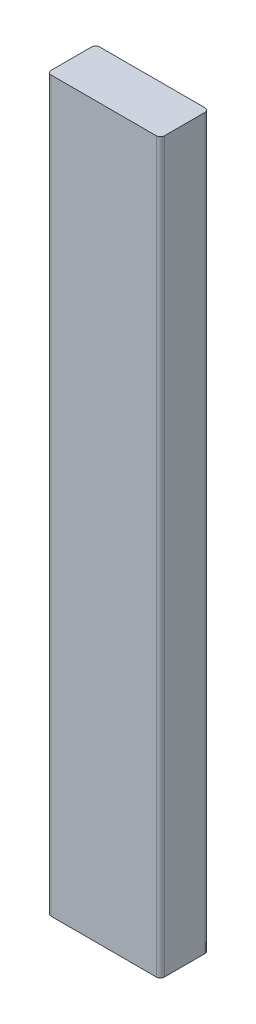
ISO-10303-21;
HEADER;
FILE_DESCRIPTION(('STEP AP214'),'2;1');
FILE_NAME('part.step','',(''),(''),'','','');
FILE_SCHEMA(('AUTOMOTIVE_DESIGN { 1 0 10303 214 1 1 1 1 }'));
ENDSEC;
DATA;
#1=APPLICATION_CONTEXT('core data for automotive mechanical design processes');
#2=APPLICATION_PROTOCOL_DEFINITION('international standard','automotive_design',2000,#1);
#3=PRODUCT_CONTEXT('',#1,'mechanical');
#4=PRODUCT('Part','Part','',(#3));
#5=PRODUCT_RELATED_PRODUCT_CATEGORY('part','',(#4));
#6=PRODUCT_DEFINITION_FORMATION('','',#4);
#7=PRODUCT_DEFINITION_CONTEXT('part definition',#1,'design');
#8=PRODUCT_DEFINITION('design','',#6,#7);
#9=PRODUCT_DEFINITION_SHAPE('','',#8);
#10=(LENGTH_UNIT() NAMED_UNIT(*) SI_UNIT(.MILLI.,.METRE.));
#11=(NAMED_UNIT(*) PLANE_ANGLE_UNIT() SI_UNIT($,.RADIAN.));
#12=(NAMED_UNIT(*) SI_UNIT($,.STERADIAN.) SOLID_ANGLE_UNIT());
#13=UNCERTAINTY_MEASURE_WITH_UNIT(LENGTH_MEASURE(1.E-05),#10,'distance_accuracy_value','');
#14=(GEOMETRIC_REPRESENTATION_CONTEXT(3) GLOBAL_UNCERTAINTY_ASSIGNED_CONTEXT((#13)) GLOBAL_UNIT_ASSIGNED_CONTEXT((#10,
#11,#12)) REPRESENTATION_CONTEXT('',''));
#15=CARTESIAN_POINT('',(0.,0.,0.));
#16=DIRECTION('',(0.,0.,1.));
#17=DIRECTION('',(1.,0.,0.));
#18=AXIS2_PLACEMENT_3D('',#15,#16,#17);
#19=CARTESIAN_POINT('',(44.45,571.5,-19.05));
#20=DIRECTION('',(-1.,0.,0.));
#21=DIRECTION('',(0.,0.,1.));
#22=AXIS2_PLACEMENT_3D('',#19,#20,#21);
#23=PLANE('',#22);
#24=DIRECTION('',(0.,0.,-1.));
#25=VECTOR('',#24,1.);
#26=CARTESIAN_POINT('',(44.45,0.,-19.05));
#27=LINE('',#26,#25);
#28=CARTESIAN_POINT('',(44.45,0.,15.875));
#29=VERTEX_POINT('',#28);
#30=CARTESIAN_POINT('',(44.45,0.,-15.875));
#31=VERTEX_POINT('',#30);
#32=EDGE_CURVE('E157',#29,#31,#27,.T.);
#33=ORIENTED_EDGE('',*,*,#32,.T.);
#34=DIRECTION('',(0.,-1.,0.));
#35=VECTOR('',#34,1.);
#36=CARTESIAN_POINT('',(44.45,571.5,-15.875));
#37=LINE('',#36,#35);
#38=CARTESIAN_POINT('',(44.45,571.5,-15.875));
#39=VERTEX_POINT('',#38);
#40=EDGE_CURVE('E11',#31,#39,#37,.F.);
#41=ORIENTED_EDGE('',*,*,#40,.T.);
#42=DIRECTION('',(0.,0.,-1.));
#43=VECTOR('',#42,1.);
#44=CARTESIAN_POINT('',(44.45,571.5,-19.05));
#45=LINE('',#44,#43);
#46=CARTESIAN_POINT('',(44.45,571.5,15.875));
#47=VERTEX_POINT('',#46);
#48=EDGE_CURVE('E125',#47,#39,#45,.T.);
#49=ORIENTED_EDGE('',*,*,#48,.F.);
#50=DIRECTION('',(0.,-1.,0.));
#51=VECTOR('',#50,1.);
#52=CARTESIAN_POINT('',(44.45,571.5,15.875));
#53=LINE('',#52,#51);
#54=EDGE_CURVE('E41',#47,#29,#53,.T.);
#55=ORIENTED_EDGE('',*,*,#54,.T.);
#56=EDGE_LOOP('',(#33,#41,#49,#55));
#57=FACE_BOUND('',#56,.T.);
#58=ADVANCED_FACE('F33',(#57),#23,.F.);
#59=CARTESIAN_POINT('',(-44.45,571.5,-19.05));
#60=DIRECTION('',(0.,0.,1.));
#61=DIRECTION('',(1.,0.,0.));
#62=AXIS2_PLACEMENT_3D('',#59,#60,#61);
#63=PLANE('',#62);
#64=DIRECTION('',(-1.,0.,0.));
#65=VECTOR('',#64,1.);
#66=CARTESIAN_POINT('',(-44.45,0.,-19.05));
#67=LINE('',#66,#65);
#68=CARTESIAN_POINT('',(41.275,0.,-19.05));
#69=VERTEX_POINT('',#68);
#70=CARTESIAN_POINT('',(-41.275,0.,-19.05));
#71=VERTEX_POINT('',#70);
#72=EDGE_CURVE('E130',#69,#71,#67,.T.);
#73=ORIENTED_EDGE('',*,*,#72,.T.);
#74=DIRECTION('',(0.,-1.,0.));
#75=VECTOR('',#74,1.);
#76=CARTESIAN_POINT('',(-41.275,571.5,-19.05));
#77=LINE('',#76,#75);
#78=CARTESIAN_POINT('',(-41.275,571.5,-19.05));
#79=VERTEX_POINT('',#78);
#80=EDGE_CURVE('E48',#71,#79,#77,.F.);
#81=ORIENTED_EDGE('',*,*,#80,.T.);
#82=DIRECTION('',(-1.,0.,0.));
#83=VECTOR('',#82,1.);
#84=CARTESIAN_POINT('',(-44.45,571.5,-19.05));
#85=LINE('',#84,#83);
#86=CARTESIAN_POINT('',(41.275,571.5,-19.05));
#87=VERTEX_POINT('',#86);
#88=EDGE_CURVE('E128',#87,#79,#85,.T.);
#89=ORIENTED_EDGE('',*,*,#88,.F.);
#90=DIRECTION('',(0.,-1.,0.));
#91=VECTOR('',#90,1.);
#92=CARTESIAN_POINT('',(41.275,571.5,-19.05));
#93=LINE('',#92,#91);
#94=EDGE_CURVE('E149',#87,#69,#93,.T.);
#95=ORIENTED_EDGE('',*,*,#94,.T.);
#96=EDGE_LOOP('',(#73,#81,#89,#95));
#97=FACE_BOUND('',#96,.T.);
#98=ADVANCED_FACE('F177',(#97),#63,.F.);
#99=CARTESIAN_POINT('',(-44.45,571.5,-19.05));
#100=DIRECTION('',(1.,0.,0.));
#101=DIRECTION('',(0.,0.,-1.));
#102=AXIS2_PLACEMENT_3D('',#99,#100,#101);
#103=PLANE('',#102);
#104=DIRECTION('',(0.,0.,1.));
#105=VECTOR('',#104,1.);
#106=CARTESIAN_POINT('',(-44.45,0.,-19.05));
#107=LINE('',#106,#105);
#108=CARTESIAN_POINT('',(-44.45,0.,-15.875));
#109=VERTEX_POINT('',#108);
#110=CARTESIAN_POINT('',(-44.45,0.,15.875));
#111=VERTEX_POINT('',#110);
#112=EDGE_CURVE('E126',#109,#111,#107,.T.);
#113=ORIENTED_EDGE('',*,*,#112,.T.);
#114=DIRECTION('',(0.,-1.,0.));
#115=VECTOR('',#114,1.);
#116=CARTESIAN_POINT('',(-44.45,571.5,15.875));
#117=LINE('',#116,#115);
#118=CARTESIAN_POINT('',(-44.45,571.5,15.875));
#119=VERTEX_POINT('',#118);
#120=EDGE_CURVE('E104',#111,#119,#117,.F.);
#121=ORIENTED_EDGE('',*,*,#120,.T.);
#122=DIRECTION('',(0.,0.,1.));
#123=VECTOR('',#122,1.);
#124=CARTESIAN_POINT('',(-44.45,571.5,-19.05));
#125=LINE('',#124,#123);
#126=CARTESIAN_POINT('',(-44.45,571.5,-15.875));
#127=VERTEX_POINT('',#126);
#128=EDGE_CURVE('E165',#127,#119,#125,.T.);
#129=ORIENTED_EDGE('',*,*,#128,.F.);
#130=DIRECTION('',(0.,-1.,0.));
#131=VECTOR('',#130,1.);
#132=CARTESIAN_POINT('',(-44.45,571.5,-15.875));
#133=LINE('',#132,#131);
#134=EDGE_CURVE('E109',#127,#109,#133,.T.);
#135=ORIENTED_EDGE('',*,*,#134,.T.);
#136=EDGE_LOOP('',(#113,#121,#129,#135));
#137=FACE_BOUND('',#136,.T.);
#138=ADVANCED_FACE('F176',(#137),#103,.F.);
#139=CARTESIAN_POINT('',(-44.45,571.5,19.05));
#140=DIRECTION('',(0.,0.,-1.));
#141=DIRECTION('',(-1.,0.,0.));
#142=AXIS2_PLACEMENT_3D('',#139,#140,#141);
#143=PLANE('',#142);
#144=DIRECTION('',(1.,0.,0.));
#145=VECTOR('',#144,1.);
#146=CARTESIAN_POINT('',(-44.45,571.5,19.05));
#147=LINE('',#146,#145);
#148=CARTESIAN_POINT('',(-41.275,571.5,19.05));
#149=VERTEX_POINT('',#148);
#150=CARTESIAN_POINT('',(41.275,571.5,19.05));
#151=VERTEX_POINT('',#150);
#152=EDGE_CURVE('E119',#149,#151,#147,.T.);
#153=ORIENTED_EDGE('',*,*,#152,.F.);
#154=DIRECTION('',(0.,-1.,0.));
#155=VECTOR('',#154,1.);
#156=CARTESIAN_POINT('',(-41.275,571.5,19.05));
#157=LINE('',#156,#155);
#158=CARTESIAN_POINT('',(-41.275,0.,19.05));
#159=VERTEX_POINT('',#158);
#160=EDGE_CURVE('E103',#149,#159,#157,.T.);
#161=ORIENTED_EDGE('',*,*,#160,.T.);
#162=DIRECTION('',(1.,0.,0.));
#163=VECTOR('',#162,1.);
#164=CARTESIAN_POINT('',(-44.45,0.,19.05));
#165=LINE('',#164,#163);
#166=CARTESIAN_POINT('',(41.275,0.,19.05));
#167=VERTEX_POINT('',#166);
#168=EDGE_CURVE('E116',#159,#167,#165,.T.);
#169=ORIENTED_EDGE('',*,*,#168,.T.);
#170=DIRECTION('',(0.,-1.,0.));
#171=VECTOR('',#170,1.);
#172=CARTESIAN_POINT('',(41.275,571.5,19.05));
#173=LINE('',#172,#171);
#174=EDGE_CURVE('E121',#167,#151,#173,.F.);
#175=ORIENTED_EDGE('',*,*,#174,.T.);
#176=EDGE_LOOP('',(#153,#161,#169,#175));
#177=FACE_BOUND('',#176,.T.);
#178=ADVANCED_FACE('F115',(#177),#143,.F.);
#179=CARTESIAN_POINT('',(0.,571.5,0.));
#180=DIRECTION('',(0.,1.,0.));
#181=DIRECTION('',(0.,0.,1.));
#182=AXIS2_PLACEMENT_3D('',#179,#180,#181);
#183=PLANE('',#182);
#184=ORIENTED_EDGE('',*,*,#128,.T.);
#185=CARTESIAN_POINT('',(-41.275,571.5,15.875));
#186=DIRECTION('',(0.,1.,0.));
#187=DIRECTION('',(0.,0.,1.));
#188=AXIS2_PLACEMENT_3D('',#185,#186,#187);
#189=CIRCLE('',#188,3.175);
#190=EDGE_CURVE('E147',#119,#149,#189,.T.);
#191=ORIENTED_EDGE('',*,*,#190,.T.);
#192=ORIENTED_EDGE('',*,*,#152,.T.);
#193=CARTESIAN_POINT('',(41.275,571.5,15.875));
#194=DIRECTION('',(0.,1.,0.));
#195=DIRECTION('',(0.,0.,1.));
#196=AXIS2_PLACEMENT_3D('',#193,#194,#195);
#197=CIRCLE('',#196,3.175);
#198=EDGE_CURVE('E142',#151,#47,#197,.T.);
#199=ORIENTED_EDGE('',*,*,#198,.T.);
#200=ORIENTED_EDGE('',*,*,#48,.T.);
#201=CARTESIAN_POINT('',(41.275,571.5,-15.875));
#202=DIRECTION('',(0.,1.,0.));
#203=DIRECTION('',(0.,0.,1.));
#204=AXIS2_PLACEMENT_3D('',#201,#202,#203);
#205=CIRCLE('',#204,3.175);
#206=EDGE_CURVE('E55',#39,#87,#205,.T.);
#207=ORIENTED_EDGE('',*,*,#206,.T.);
#208=ORIENTED_EDGE('',*,*,#88,.T.);
#209=CARTESIAN_POINT('',(-41.275,571.5,-15.875));
#210=DIRECTION('',(0.,1.,0.));
#211=DIRECTION('',(0.,0.,1.));
#212=AXIS2_PLACEMENT_3D('',#209,#210,#211);
#213=CIRCLE('',#212,3.175);
#214=EDGE_CURVE('E145',#79,#127,#213,.T.);
#215=ORIENTED_EDGE('',*,*,#214,.T.);
#216=EDGE_LOOP('',(#184,#191,#192,#199,#200,#207,#208,#215));
#217=FACE_BOUND('',#216,.T.);
#218=ADVANCED_FACE('F169',(#217),#183,.T.);
#219=CARTESIAN_POINT('',(0.,0.,0.));
#220=DIRECTION('',(0.,1.,0.));
#221=DIRECTION('',(0.,0.,1.));
#222=AXIS2_PLACEMENT_3D('',#219,#220,#221);
#223=PLANE('',#222);
#224=ORIENTED_EDGE('',*,*,#168,.F.);
#225=CARTESIAN_POINT('',(-41.275,0.,15.875));
#226=DIRECTION('',(0.,1.,0.));
#227=DIRECTION('',(0.,0.,1.));
#228=AXIS2_PLACEMENT_3D('',#225,#226,#227);
#229=CIRCLE('',#228,3.175);
#230=EDGE_CURVE('E99',#159,#111,#229,.F.);
#231=ORIENTED_EDGE('',*,*,#230,.T.);
#232=ORIENTED_EDGE('',*,*,#112,.F.);
#233=CARTESIAN_POINT('',(-41.275,0.,-15.875));
#234=DIRECTION('',(0.,1.,0.));
#235=DIRECTION('',(0.,0.,1.));
#236=AXIS2_PLACEMENT_3D('',#233,#234,#235);
#237=CIRCLE('',#236,3.175);
#238=EDGE_CURVE('E110',#109,#71,#237,.F.);
#239=ORIENTED_EDGE('',*,*,#238,.T.);
#240=ORIENTED_EDGE('',*,*,#72,.F.);
#241=CARTESIAN_POINT('',(41.275,0.,-15.875));
#242=DIRECTION('',(0.,1.,0.));
#243=DIRECTION('',(0.,0.,1.));
#244=AXIS2_PLACEMENT_3D('',#241,#242,#243);
#245=CIRCLE('',#244,3.175);
#246=EDGE_CURVE('E136',#69,#31,#245,.F.);
#247=ORIENTED_EDGE('',*,*,#246,.T.);
#248=ORIENTED_EDGE('',*,*,#32,.F.);
#249=CARTESIAN_POINT('',(41.275,0.,15.875));
#250=DIRECTION('',(0.,1.,0.));
#251=DIRECTION('',(0.,0.,1.));
#252=AXIS2_PLACEMENT_3D('',#249,#250,#251);
#253=CIRCLE('',#252,3.175);
#254=EDGE_CURVE('E120',#29,#167,#253,.F.);
#255=ORIENTED_EDGE('',*,*,#254,.T.);
#256=EDGE_LOOP('',(#224,#231,#232,#239,#240,#247,#248,#255));
#257=FACE_BOUND('',#256,.T.);
#258=ADVANCED_FACE('F123',(#257),#223,.F.);
#259=CARTESIAN_POINT('',(-41.275,571.5,15.875));
#260=DIRECTION('',(0.,-1.,0.));
#261=DIRECTION('',(0.,0.,-1.));
#262=AXIS2_PLACEMENT_3D('',#259,#260,#261);
#263=CYLINDRICAL_SURFACE('',#262,3.175);
#264=ORIENTED_EDGE('',*,*,#190,.F.);
#265=ORIENTED_EDGE('',*,*,#120,.F.);
#266=ORIENTED_EDGE('',*,*,#230,.F.);
#267=ORIENTED_EDGE('',*,*,#160,.F.);
#268=EDGE_LOOP('',(#264,#265,#266,#267));
#269=FACE_BOUND('',#268,.T.);
#270=ADVANCED_FACE('F102',(#269),#263,.T.);
#271=CARTESIAN_POINT('',(-41.275,571.5,-15.875));
#272=DIRECTION('',(0.,-1.,0.));
#273=DIRECTION('',(0.,0.,-1.));
#274=AXIS2_PLACEMENT_3D('',#271,#272,#273);
#275=CYLINDRICAL_SURFACE('',#274,3.175);
#276=ORIENTED_EDGE('',*,*,#214,.F.);
#277=ORIENTED_EDGE('',*,*,#80,.F.);
#278=ORIENTED_EDGE('',*,*,#238,.F.);
#279=ORIENTED_EDGE('',*,*,#134,.F.);
#280=EDGE_LOOP('',(#276,#277,#278,#279));
#281=FACE_BOUND('',#280,.T.);
#282=ADVANCED_FACE('F174',(#281),#275,.T.);
#283=CARTESIAN_POINT('',(41.275,571.5,-15.875));
#284=DIRECTION('',(0.,-1.,0.));
#285=DIRECTION('',(0.,0.,-1.));
#286=AXIS2_PLACEMENT_3D('',#283,#284,#285);
#287=CYLINDRICAL_SURFACE('',#286,3.175);
#288=ORIENTED_EDGE('',*,*,#206,.F.);
#289=ORIENTED_EDGE('',*,*,#40,.F.);
#290=ORIENTED_EDGE('',*,*,#246,.F.);
#291=ORIENTED_EDGE('',*,*,#94,.F.);
#292=EDGE_LOOP('',(#288,#289,#290,#291));
#293=FACE_BOUND('',#292,.T.);
#294=ADVANCED_FACE('F179',(#293),#287,.T.);
#295=CARTESIAN_POINT('',(41.275,571.5,15.875));
#296=DIRECTION('',(0.,-1.,0.));
#297=DIRECTION('',(0.,0.,-1.));
#298=AXIS2_PLACEMENT_3D('',#295,#296,#297);
#299=CYLINDRICAL_SURFACE('',#298,3.175);
#300=ORIENTED_EDGE('',*,*,#198,.F.);
#301=ORIENTED_EDGE('',*,*,#174,.F.);
#302=ORIENTED_EDGE('',*,*,#254,.F.);
#303=ORIENTED_EDGE('',*,*,#54,.F.);
#304=EDGE_LOOP('',(#300,#301,#302,#303));
#305=FACE_BOUND('',#304,.T.);
#306=ADVANCED_FACE('F35',(#305),#299,.T.);
#307=CLOSED_SHELL('',(#58,#98,#138,#178,#218,#258,#270,#282,#294,#306));
#308=MANIFOLD_SOLID_BREP('B2',#307);
#309=ADVANCED_BREP_SHAPE_REPRESENTATION('',(#18,#308),#14);
#310=SHAPE_DEFINITION_REPRESENTATION(#9,#309);
ENDSEC;
END-ISO-10303-21;
